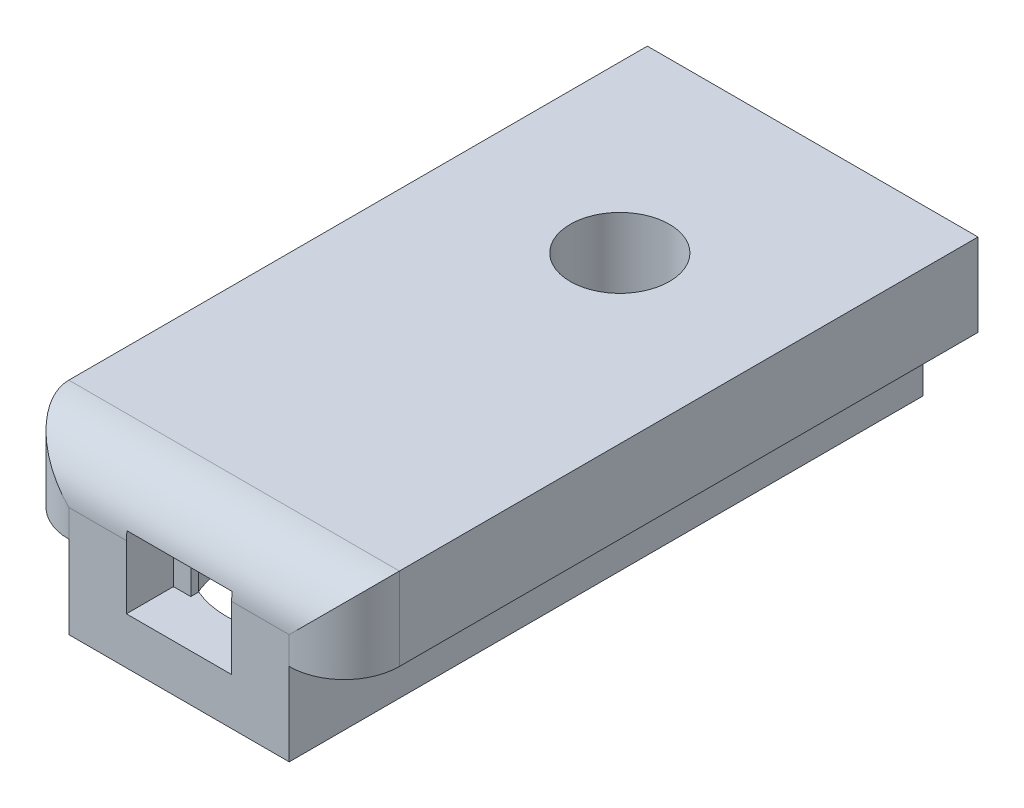
ISO-10303-21;
HEADER;
FILE_DESCRIPTION(('STEP AP214'),'2;1');
FILE_NAME('part.step','',(''),(''),'','','');
FILE_SCHEMA(('AUTOMOTIVE_DESIGN { 1 0 10303 214 1 1 1 1 }'));
ENDSEC;
DATA;
#1=APPLICATION_CONTEXT('core data for automotive mechanical design processes');
#2=APPLICATION_PROTOCOL_DEFINITION('international standard','automotive_design',2000,#1);
#3=PRODUCT_CONTEXT('',#1,'mechanical');
#4=PRODUCT('Part','Part','',(#3));
#5=PRODUCT_RELATED_PRODUCT_CATEGORY('part','',(#4));
#6=PRODUCT_DEFINITION_FORMATION('','',#4);
#7=PRODUCT_DEFINITION_CONTEXT('part definition',#1,'design');
#8=PRODUCT_DEFINITION('design','',#6,#7);
#9=PRODUCT_DEFINITION_SHAPE('','',#8);
#10=(LENGTH_UNIT() NAMED_UNIT(*) SI_UNIT(.MILLI.,.METRE.));
#11=(NAMED_UNIT(*) PLANE_ANGLE_UNIT() SI_UNIT($,.RADIAN.));
#12=(NAMED_UNIT(*) SI_UNIT($,.STERADIAN.) SOLID_ANGLE_UNIT());
#13=UNCERTAINTY_MEASURE_WITH_UNIT(LENGTH_MEASURE(1.E-05),#10,'distance_accuracy_value','');
#14=(GEOMETRIC_REPRESENTATION_CONTEXT(3) GLOBAL_UNCERTAINTY_ASSIGNED_CONTEXT((#13)) GLOBAL_UNIT_ASSIGNED_CONTEXT((#10,
#11,#12)) REPRESENTATION_CONTEXT('',''));
#15=CARTESIAN_POINT('',(0.,0.,0.));
#16=DIRECTION('',(0.,0.,1.));
#17=DIRECTION('',(1.,0.,0.));
#18=AXIS2_PLACEMENT_3D('',#15,#16,#17);
#19=CARTESIAN_POINT('',(0.,0.,9.79));
#20=DIRECTION('',(0.,0.,-1.));
#21=DIRECTION('',(-1.,0.,0.));
#22=AXIS2_PLACEMENT_3D('',#19,#20,#21);
#23=PLANE('',#22);
#24=DIRECTION('',(0.,1.,0.));
#25=VECTOR('',#24,1.);
#26=CARTESIAN_POINT('',(1.28330795126696,3.9,9.79));
#27=LINE('',#26,#25);
#28=CARTESIAN_POINT('',(1.28330795126696,1.7,9.79));
#29=VERTEX_POINT('',#28);
#30=CARTESIAN_POINT('',(1.28330795126696,3.9,9.79));
#31=VERTEX_POINT('',#30);
#32=EDGE_CURVE('E321',#29,#31,#27,.T.);
#33=ORIENTED_EDGE('',*,*,#32,.F.);
#34=DIRECTION('',(1.,0.,0.));
#35=VECTOR('',#34,1.);
#36=CARTESIAN_POINT('',(1.91,1.7,9.79));
#37=LINE('',#36,#35);
#38=CARTESIAN_POINT('',(1.91,1.7,9.79));
#39=VERTEX_POINT('',#38);
#40=EDGE_CURVE('E201',#29,#39,#37,.T.);
#41=ORIENTED_EDGE('',*,*,#40,.T.);
#42=DIRECTION('',(0.,1.,0.));
#43=VECTOR('',#42,1.);
#44=CARTESIAN_POINT('',(1.91,4.3,9.79));
#45=LINE('',#44,#43);
#46=CARTESIAN_POINT('',(1.91,4.3,9.79));
#47=VERTEX_POINT('',#46);
#48=EDGE_CURVE('E206',#39,#47,#45,.T.);
#49=ORIENTED_EDGE('',*,*,#48,.T.);
#50=DIRECTION('',(-1.,0.,0.));
#51=VECTOR('',#50,1.);
#52=CARTESIAN_POINT('',(1.91,4.3,9.79));
#53=LINE('',#52,#51);
#54=CARTESIAN_POINT('',(-1.91,4.3,9.79));
#55=VERTEX_POINT('',#54);
#56=EDGE_CURVE('E209',#47,#55,#53,.T.);
#57=ORIENTED_EDGE('',*,*,#56,.T.);
#58=DIRECTION('',(0.,-1.,0.));
#59=VECTOR('',#58,1.);
#60=CARTESIAN_POINT('',(-1.91,4.3,9.79));
#61=LINE('',#60,#59);
#62=CARTESIAN_POINT('',(-1.91,1.7,9.79));
#63=VERTEX_POINT('',#62);
#64=EDGE_CURVE('E198',#55,#63,#61,.T.);
#65=ORIENTED_EDGE('',*,*,#64,.T.);
#66=CARTESIAN_POINT('',(-1.28330795126696,1.7,9.79));
#67=VERTEX_POINT('',#66);
#68=EDGE_CURVE('E203',#63,#67,#37,.T.);
#69=ORIENTED_EDGE('',*,*,#68,.T.);
#70=DIRECTION('',(0.,-1.,0.));
#71=VECTOR('',#70,1.);
#72=CARTESIAN_POINT('',(-1.28330795126696,3.9,9.79));
#73=LINE('',#72,#71);
#74=CARTESIAN_POINT('',(-1.28330795126696,3.9,9.79));
#75=VERTEX_POINT('',#74);
#76=EDGE_CURVE('E194',#75,#67,#73,.T.);
#77=ORIENTED_EDGE('',*,*,#76,.F.);
#78=DIRECTION('',(-1.,0.,0.));
#79=VECTOR('',#78,1.);
#80=CARTESIAN_POINT('',(-1.28330795126696,3.9,9.79));
#81=LINE('',#80,#79);
#82=EDGE_CURVE('E188',#31,#75,#81,.T.);
#83=ORIENTED_EDGE('',*,*,#82,.F.);
#84=EDGE_LOOP('',(#33,#41,#49,#57,#65,#69,#77,#83));
#85=FACE_BOUND('',#84,.T.);
#86=ADVANCED_FACE('F39',(#85),#23,.F.);
#87=CARTESIAN_POINT('',(-6.,6.,-11.5));
#88=DIRECTION('',(1.,0.,0.));
#89=DIRECTION('',(0.,0.,-1.));
#90=AXIS2_PLACEMENT_3D('',#87,#88,#89);
#91=PLANE('',#90);
#92=DIRECTION('',(0.,0.,1.));
#93=VECTOR('',#92,1.);
#94=CARTESIAN_POINT('',(-6.,3.,-11.5));
#95=LINE('',#94,#93);
#96=CARTESIAN_POINT('',(-6.,3.,-11.5));
#97=VERTEX_POINT('',#96);
#98=CARTESIAN_POINT('',(-6.,3.,9.5));
#99=VERTEX_POINT('',#98);
#100=EDGE_CURVE('E240',#97,#99,#95,.T.);
#101=ORIENTED_EDGE('',*,*,#100,.T.);
#102=DIRECTION('',(0.,-1.,0.));
#103=VECTOR('',#102,1.);
#104=CARTESIAN_POINT('',(-6.,6.,9.5));
#105=LINE('',#104,#103);
#106=CARTESIAN_POINT('',(-6.,6.,9.5));
#107=VERTEX_POINT('',#106);
#108=EDGE_CURVE('E11',#99,#107,#105,.F.);
#109=ORIENTED_EDGE('',*,*,#108,.T.);
#110=DIRECTION('',(0.,0.,1.));
#111=VECTOR('',#110,1.);
#112=CARTESIAN_POINT('',(-6.,6.,-11.5));
#113=LINE('',#112,#111);
#114=CARTESIAN_POINT('',(-6.,6.,-11.5));
#115=VERTEX_POINT('',#114);
#116=EDGE_CURVE('E261',#115,#107,#113,.T.);
#117=ORIENTED_EDGE('',*,*,#116,.F.);
#118=DIRECTION('',(0.,-1.,0.));
#119=VECTOR('',#118,1.);
#120=CARTESIAN_POINT('',(-6.,6.,-11.5));
#121=LINE('',#120,#119);
#122=EDGE_CURVE('E269',#115,#97,#121,.T.);
#123=ORIENTED_EDGE('',*,*,#122,.T.);
#124=EDGE_LOOP('',(#101,#109,#117,#123));
#125=FACE_BOUND('',#124,.T.);
#126=ADVANCED_FACE('F363',(#125),#91,.F.);
#127=CARTESIAN_POINT('',(6.,6.,11.5));
#128=DIRECTION('',(0.,0.,-1.));
#129=DIRECTION('',(-1.,0.,0.));
#130=AXIS2_PLACEMENT_3D('',#127,#128,#129);
#131=PLANE('',#130);
#132=DIRECTION('',(0.,-1.,0.));
#133=VECTOR('',#132,1.);
#134=CARTESIAN_POINT('',(4.,0.,11.5));
#135=LINE('',#134,#133);
#136=CARTESIAN_POINT('',(4.,3.,11.5));
#137=VERTEX_POINT('',#136);
#138=CARTESIAN_POINT('',(4.,0.,11.5));
#139=VERTEX_POINT('',#138);
#140=EDGE_CURVE('E239',#137,#139,#135,.T.);
#141=ORIENTED_EDGE('',*,*,#140,.F.);
#142=DIRECTION('',(0.,-1.,0.));
#143=VECTOR('',#142,1.);
#144=CARTESIAN_POINT('',(4.,6.,11.5));
#145=LINE('',#144,#143);
#146=CARTESIAN_POINT('',(4.,4.,11.5));
#147=VERTEX_POINT('',#146);
#148=EDGE_CURVE('E290',#137,#147,#145,.F.);
#149=ORIENTED_EDGE('',*,*,#148,.T.);
#150=DIRECTION('',(1.,0.,0.));
#151=VECTOR('',#150,1.);
#152=CARTESIAN_POINT('',(6.,4.,11.5));
#153=LINE('',#152,#151);
#154=CARTESIAN_POINT('',(1.91,4.,11.5));
#155=VERTEX_POINT('',#154);
#156=EDGE_CURVE('E288',#147,#155,#153,.F.);
#157=ORIENTED_EDGE('',*,*,#156,.T.);
#158=DIRECTION('',(0.,1.,0.));
#159=VECTOR('',#158,1.);
#160=CARTESIAN_POINT('',(1.91,4.3,11.5));
#161=LINE('',#160,#159);
#162=CARTESIAN_POINT('',(1.91,1.7,11.5));
#163=VERTEX_POINT('',#162);
#164=EDGE_CURVE('E202',#163,#155,#161,.T.);
#165=ORIENTED_EDGE('',*,*,#164,.F.);
#166=DIRECTION('',(1.,0.,0.));
#167=VECTOR('',#166,1.);
#168=CARTESIAN_POINT('',(1.91,1.7,11.5));
#169=LINE('',#168,#167);
#170=CARTESIAN_POINT('',(-1.91,1.7,11.5));
#171=VERTEX_POINT('',#170);
#172=EDGE_CURVE('E215',#171,#163,#169,.T.);
#173=ORIENTED_EDGE('',*,*,#172,.F.);
#174=DIRECTION('',(0.,-1.,0.));
#175=VECTOR('',#174,1.);
#176=CARTESIAN_POINT('',(-1.91,4.3,11.5));
#177=LINE('',#176,#175);
#178=CARTESIAN_POINT('',(-1.91,4.,11.5));
#179=VERTEX_POINT('',#178);
#180=EDGE_CURVE('E213',#179,#171,#177,.T.);
#181=ORIENTED_EDGE('',*,*,#180,.F.);
#182=DIRECTION('',(1.,0.,0.));
#183=VECTOR('',#182,1.);
#184=CARTESIAN_POINT('',(6.,4.,11.5));
#185=LINE('',#184,#183);
#186=CARTESIAN_POINT('',(-4.,4.,11.5));
#187=VERTEX_POINT('',#186);
#188=EDGE_CURVE('E286',#179,#187,#185,.F.);
#189=ORIENTED_EDGE('',*,*,#188,.T.);
#190=DIRECTION('',(0.,-1.,0.));
#191=VECTOR('',#190,1.);
#192=CARTESIAN_POINT('',(-4.,6.,11.5));
#193=LINE('',#192,#191);
#194=CARTESIAN_POINT('',(-4.,3.,11.5));
#195=VERTEX_POINT('',#194);
#196=EDGE_CURVE('E284',#187,#195,#193,.T.);
#197=ORIENTED_EDGE('',*,*,#196,.T.);
#198=DIRECTION('',(0.,1.,0.));
#199=VECTOR('',#198,1.);
#200=CARTESIAN_POINT('',(-4.,0.,11.5));
#201=LINE('',#200,#199);
#202=CARTESIAN_POINT('',(-4.,0.,11.5));
#203=VERTEX_POINT('',#202);
#204=EDGE_CURVE('E233',#203,#195,#201,.T.);
#205=ORIENTED_EDGE('',*,*,#204,.F.);
#206=DIRECTION('',(1.,0.,0.));
#207=VECTOR('',#206,1.);
#208=CARTESIAN_POINT('',(6.,0.,11.5));
#209=LINE('',#208,#207);
#210=EDGE_CURVE('E242',#203,#139,#209,.T.);
#211=ORIENTED_EDGE('',*,*,#210,.T.);
#212=EDGE_LOOP('',(#141,#149,#157,#165,#173,#181,#189,#197,#205,#211));
#213=FACE_BOUND('',#212,.T.);
#214=ADVANCED_FACE('F349',(#213),#131,.F.);
#215=CARTESIAN_POINT('',(6.,6.,-11.5));
#216=DIRECTION('',(-1.,0.,0.));
#217=DIRECTION('',(0.,0.,1.));
#218=AXIS2_PLACEMENT_3D('',#215,#216,#217);
#219=PLANE('',#218);
#220=DIRECTION('',(0.,0.,-1.));
#221=VECTOR('',#220,1.);
#222=CARTESIAN_POINT('',(6.,6.,-11.5));
#223=LINE('',#222,#221);
#224=CARTESIAN_POINT('',(6.,6.,9.5));
#225=VERTEX_POINT('',#224);
#226=CARTESIAN_POINT('',(6.,6.,-11.5));
#227=VERTEX_POINT('',#226);
#228=EDGE_CURVE('E264',#225,#227,#223,.T.);
#229=ORIENTED_EDGE('',*,*,#228,.F.);
#230=DIRECTION('',(0.,-1.,0.));
#231=VECTOR('',#230,1.);
#232=CARTESIAN_POINT('',(6.,6.,9.5));
#233=LINE('',#232,#231);
#234=CARTESIAN_POINT('',(6.,3.,9.5));
#235=VERTEX_POINT('',#234);
#236=EDGE_CURVE('E279',#225,#235,#233,.T.);
#237=ORIENTED_EDGE('',*,*,#236,.T.);
#238=DIRECTION('',(0.,0.,1.));
#239=VECTOR('',#238,1.);
#240=CARTESIAN_POINT('',(6.,3.,-11.5));
#241=LINE('',#240,#239);
#242=CARTESIAN_POINT('',(6.,3.,-11.5));
#243=VERTEX_POINT('',#242);
#244=EDGE_CURVE('E246',#243,#235,#241,.T.);
#245=ORIENTED_EDGE('',*,*,#244,.F.);
#246=DIRECTION('',(0.,-1.,0.));
#247=VECTOR('',#246,1.);
#248=CARTESIAN_POINT('',(6.,6.,-11.5));
#249=LINE('',#248,#247);
#250=EDGE_CURVE('E276',#227,#243,#249,.T.);
#251=ORIENTED_EDGE('',*,*,#250,.F.);
#252=EDGE_LOOP('',(#229,#237,#245,#251));
#253=FACE_BOUND('',#252,.T.);
#254=ADVANCED_FACE('F388',(#253),#219,.F.);
#255=CARTESIAN_POINT('',(6.,6.,-11.5));
#256=DIRECTION('',(0.,0.,1.));
#257=DIRECTION('',(1.,0.,0.));
#258=AXIS2_PLACEMENT_3D('',#255,#256,#257);
#259=PLANE('',#258);
#260=DIRECTION('',(0.,1.,0.));
#261=VECTOR('',#260,1.);
#262=CARTESIAN_POINT('',(-4.,0.,-11.5));
#263=LINE('',#262,#261);
#264=CARTESIAN_POINT('',(-4.,0.,-11.5));
#265=VERTEX_POINT('',#264);
#266=CARTESIAN_POINT('',(-4.,3.,-11.5));
#267=VERTEX_POINT('',#266);
#268=EDGE_CURVE('E229',#265,#267,#263,.T.);
#269=ORIENTED_EDGE('',*,*,#268,.T.);
#270=DIRECTION('',(-1.,0.,0.));
#271=VECTOR('',#270,1.);
#272=CARTESIAN_POINT('',(-6.,3.,-11.5));
#273=LINE('',#272,#271);
#274=EDGE_CURVE('E232',#267,#97,#273,.T.);
#275=ORIENTED_EDGE('',*,*,#274,.T.);
#276=ORIENTED_EDGE('',*,*,#122,.F.);
#277=DIRECTION('',(-1.,0.,0.));
#278=VECTOR('',#277,1.);
#279=CARTESIAN_POINT('',(6.,6.,-11.5));
#280=LINE('',#279,#278);
#281=EDGE_CURVE('E267',#227,#115,#280,.T.);
#282=ORIENTED_EDGE('',*,*,#281,.F.);
#283=ORIENTED_EDGE('',*,*,#250,.T.);
#284=DIRECTION('',(-1.,0.,0.));
#285=VECTOR('',#284,1.);
#286=CARTESIAN_POINT('',(6.,3.,-11.5));
#287=LINE('',#286,#285);
#288=CARTESIAN_POINT('',(4.,3.,-11.5));
#289=VERTEX_POINT('',#288);
#290=EDGE_CURVE('E256',#243,#289,#287,.T.);
#291=ORIENTED_EDGE('',*,*,#290,.T.);
#292=DIRECTION('',(0.,-1.,0.));
#293=VECTOR('',#292,1.);
#294=CARTESIAN_POINT('',(4.,0.,-11.5));
#295=LINE('',#294,#293);
#296=CARTESIAN_POINT('',(4.,0.,-11.5));
#297=VERTEX_POINT('',#296);
#298=EDGE_CURVE('E249',#289,#297,#295,.T.);
#299=ORIENTED_EDGE('',*,*,#298,.T.);
#300=DIRECTION('',(-1.,0.,0.));
#301=VECTOR('',#300,1.);
#302=CARTESIAN_POINT('',(6.,0.,-11.5));
#303=LINE('',#302,#301);
#304=EDGE_CURVE('E265',#297,#265,#303,.T.);
#305=ORIENTED_EDGE('',*,*,#304,.T.);
#306=EDGE_LOOP('',(#269,#275,#276,#282,#283,#291,#299,#305));
#307=FACE_BOUND('',#306,.T.);
#308=ADVANCED_FACE('F371',(#307),#259,.F.);
#309=CARTESIAN_POINT('',(0.,6.,0.));
#310=DIRECTION('',(0.,-1.,0.));
#311=DIRECTION('',(0.,0.,-1.));
#312=AXIS2_PLACEMENT_3D('',#309,#310,#311);
#313=PLANE('',#312);
#314=CARTESIAN_POINT('',(0.,6.,-4.5));
#315=DIRECTION('',(0.,1.,0.));
#316=DIRECTION('',(0.,0.,1.));
#317=AXIS2_PLACEMENT_3D('',#314,#315,#316);
#318=CIRCLE('',#317,1.8);
#319=CARTESIAN_POINT('',(0.,6.,-2.7));
#320=VERTEX_POINT('',#319);
#321=EDGE_CURVE('E566',#320,#320,#318,.T.);
#322=ORIENTED_EDGE('',*,*,#321,.F.);
#323=EDGE_LOOP('',(#322));
#324=FACE_BOUND('',#323,.T.);
#325=ORIENTED_EDGE('',*,*,#116,.T.);
#326=DIRECTION('',(1.,0.,0.));
#327=VECTOR('',#326,1.);
#328=CARTESIAN_POINT('',(0.,6.,9.5));
#329=LINE('',#328,#327);
#330=EDGE_CURVE('E292',#107,#225,#329,.T.);
#331=ORIENTED_EDGE('',*,*,#330,.T.);
#332=ORIENTED_EDGE('',*,*,#228,.T.);
#333=ORIENTED_EDGE('',*,*,#281,.T.);
#334=EDGE_LOOP('',(#325,#331,#332,#333));
#335=FACE_BOUND('',#334,.T.);
#336=ADVANCED_FACE('F365',(#324,#335),#313,.F.);
#337=CARTESIAN_POINT('',(0.,0.,0.));
#338=DIRECTION('',(0.,-1.,0.));
#339=DIRECTION('',(0.,0.,-1.));
#340=AXIS2_PLACEMENT_3D('',#337,#338,#339);
#341=PLANE('',#340);
#342=CARTESIAN_POINT('',(0.,0.,-4.5));
#343=DIRECTION('',(0.,1.,0.));
#344=DIRECTION('',(0.,0.,1.));
#345=AXIS2_PLACEMENT_3D('',#342,#343,#344);
#346=CIRCLE('',#345,0.899999999999999);
#347=CARTESIAN_POINT('',(0.,0.,-3.6));
#348=VERTEX_POINT('',#347);
#349=EDGE_CURVE('E301',#348,#348,#346,.T.);
#350=ORIENTED_EDGE('',*,*,#349,.T.);
#351=EDGE_LOOP('',(#350));
#352=FACE_BOUND('',#351,.T.);
#353=CARTESIAN_POINT('',(0.,0.,6.5));
#354=DIRECTION('',(0.,-1.,0.));
#355=DIRECTION('',(0.,0.,-1.));
#356=AXIS2_PLACEMENT_3D('',#353,#354,#355);
#357=CIRCLE('',#356,3.265);
#358=CARTESIAN_POINT('',(0.,0.,3.235));
#359=VERTEX_POINT('',#358);
#360=EDGE_CURVE('E175',#359,#359,#357,.T.);
#361=ORIENTED_EDGE('',*,*,#360,.F.);
#362=EDGE_LOOP('',(#361));
#363=FACE_BOUND('',#362,.T.);
#364=DIRECTION('',(0.,0.,1.));
#365=VECTOR('',#364,1.);
#366=CARTESIAN_POINT('',(-4.,0.,-11.5));
#367=LINE('',#366,#365);
#368=EDGE_CURVE('E236',#265,#203,#367,.T.);
#369=ORIENTED_EDGE('',*,*,#368,.F.);
#370=ORIENTED_EDGE('',*,*,#304,.F.);
#371=DIRECTION('',(0.,0.,1.));
#372=VECTOR('',#371,1.);
#373=CARTESIAN_POINT('',(4.,0.,-11.5));
#374=LINE('',#373,#372);
#375=EDGE_CURVE('E222',#297,#139,#374,.T.);
#376=ORIENTED_EDGE('',*,*,#375,.T.);
#377=ORIENTED_EDGE('',*,*,#210,.F.);
#378=EDGE_LOOP('',(#369,#370,#376,#377));
#379=FACE_BOUND('',#378,.T.);
#380=ADVANCED_FACE('F379',(#352,#363,#379),#341,.T.);
#381=CARTESIAN_POINT('',(4.,0.,-11.5));
#382=DIRECTION('',(-1.,0.,0.));
#383=DIRECTION('',(0.,0.,1.));
#384=AXIS2_PLACEMENT_3D('',#381,#382,#383);
#385=PLANE('',#384);
#386=ORIENTED_EDGE('',*,*,#140,.T.);
#387=ORIENTED_EDGE('',*,*,#375,.F.);
#388=ORIENTED_EDGE('',*,*,#298,.F.);
#389=DIRECTION('',(0.,0.,1.));
#390=VECTOR('',#389,1.);
#391=CARTESIAN_POINT('',(4.,3.,-11.5));
#392=LINE('',#391,#390);
#393=EDGE_CURVE('E250',#289,#137,#392,.T.);
#394=ORIENTED_EDGE('',*,*,#393,.T.);
#395=EDGE_LOOP('',(#386,#387,#388,#394));
#396=FACE_BOUND('',#395,.T.);
#397=ADVANCED_FACE('F383',(#396),#385,.F.);
#398=CARTESIAN_POINT('',(6.,3.,-11.5));
#399=DIRECTION('',(0.,1.,0.));
#400=DIRECTION('',(0.,0.,1.));
#401=AXIS2_PLACEMENT_3D('',#398,#399,#400);
#402=PLANE('',#401);
#403=ORIENTED_EDGE('',*,*,#244,.T.);
#404=CARTESIAN_POINT('',(4.,3.,9.5));
#405=DIRECTION('',(0.,1.,0.));
#406=DIRECTION('',(0.,0.,1.));
#407=AXIS2_PLACEMENT_3D('',#404,#405,#406);
#408=CIRCLE('',#407,2.);
#409=EDGE_CURVE('E282',#235,#137,#408,.F.);
#410=ORIENTED_EDGE('',*,*,#409,.T.);
#411=ORIENTED_EDGE('',*,*,#393,.F.);
#412=ORIENTED_EDGE('',*,*,#290,.F.);
#413=EDGE_LOOP('',(#403,#410,#411,#412));
#414=FACE_BOUND('',#413,.T.);
#415=ADVANCED_FACE('F386',(#414),#402,.F.);
#416=CARTESIAN_POINT('',(-6.,3.,-11.5));
#417=DIRECTION('',(0.,1.,0.));
#418=DIRECTION('',(0.,0.,1.));
#419=AXIS2_PLACEMENT_3D('',#416,#417,#418);
#420=PLANE('',#419);
#421=DIRECTION('',(0.,0.,1.));
#422=VECTOR('',#421,1.);
#423=CARTESIAN_POINT('',(-4.,3.,-11.5));
#424=LINE('',#423,#422);
#425=EDGE_CURVE('E243',#267,#195,#424,.T.);
#426=ORIENTED_EDGE('',*,*,#425,.T.);
#427=CARTESIAN_POINT('',(-4.,3.,9.5));
#428=DIRECTION('',(0.,1.,0.));
#429=DIRECTION('',(0.,0.,1.));
#430=AXIS2_PLACEMENT_3D('',#427,#428,#429);
#431=CIRCLE('',#430,2.);
#432=EDGE_CURVE('E48',#195,#99,#431,.F.);
#433=ORIENTED_EDGE('',*,*,#432,.T.);
#434=ORIENTED_EDGE('',*,*,#100,.F.);
#435=ORIENTED_EDGE('',*,*,#274,.F.);
#436=EDGE_LOOP('',(#426,#433,#434,#435));
#437=FACE_BOUND('',#436,.T.);
#438=ADVANCED_FACE('F373',(#437),#420,.F.);
#439=CARTESIAN_POINT('',(-4.,0.,-11.5));
#440=DIRECTION('',(1.,0.,0.));
#441=DIRECTION('',(0.,0.,-1.));
#442=AXIS2_PLACEMENT_3D('',#439,#440,#441);
#443=PLANE('',#442);
#444=ORIENTED_EDGE('',*,*,#204,.T.);
#445=ORIENTED_EDGE('',*,*,#425,.F.);
#446=ORIENTED_EDGE('',*,*,#268,.F.);
#447=ORIENTED_EDGE('',*,*,#368,.T.);
#448=EDGE_LOOP('',(#444,#445,#446,#447));
#449=FACE_BOUND('',#448,.T.);
#450=ADVANCED_FACE('F375',(#449),#443,.F.);
#451=CARTESIAN_POINT('',(-1.91,4.3,9.79));
#452=DIRECTION('',(-1.,0.,0.));
#453=DIRECTION('',(0.,-1.,0.));
#454=AXIS2_PLACEMENT_3D('',#451,#452,#453);
#455=PLANE('',#454);
#456=DIRECTION('',(0.,0.,1.));
#457=VECTOR('',#456,1.);
#458=CARTESIAN_POINT('',(-1.91,4.3,9.79));
#459=LINE('',#458,#457);
#460=CARTESIAN_POINT('',(-1.91,4.3,11.4773719933285));
#461=VERTEX_POINT('',#460);
#462=EDGE_CURVE('E220',#55,#461,#459,.T.);
#463=ORIENTED_EDGE('',*,*,#462,.T.);
#464=CARTESIAN_POINT('',(-1.91,4.,9.5));
#465=DIRECTION('',(-1.,0.,0.));
#466=DIRECTION('',(0.,-1.,0.));
#467=AXIS2_PLACEMENT_3D('',#464,#465,#466);
#468=CIRCLE('',#467,2.);
#469=EDGE_CURVE('E297',#461,#179,#468,.F.);
#470=ORIENTED_EDGE('',*,*,#469,.T.);
#471=ORIENTED_EDGE('',*,*,#180,.T.);
#472=DIRECTION('',(0.,0.,1.));
#473=VECTOR('',#472,1.);
#474=CARTESIAN_POINT('',(-1.91,1.7,9.79));
#475=LINE('',#474,#473);
#476=EDGE_CURVE('E212',#63,#171,#475,.T.);
#477=ORIENTED_EDGE('',*,*,#476,.F.);
#478=ORIENTED_EDGE('',*,*,#64,.F.);
#479=EDGE_LOOP('',(#463,#470,#471,#477,#478));
#480=FACE_BOUND('',#479,.T.);
#481=ADVANCED_FACE('F344',(#480),#455,.F.);
#482=CARTESIAN_POINT('',(1.91,4.3,9.79));
#483=DIRECTION('',(0.,1.,0.));
#484=DIRECTION('',(-1.,0.,0.));
#485=AXIS2_PLACEMENT_3D('',#482,#483,#484);
#486=PLANE('',#485);
#487=DIRECTION('',(0.,0.,1.));
#488=VECTOR('',#487,1.);
#489=CARTESIAN_POINT('',(1.91,4.3,9.79));
#490=LINE('',#489,#488);
#491=CARTESIAN_POINT('',(1.91,4.3,11.4773719933285));
#492=VERTEX_POINT('',#491);
#493=EDGE_CURVE('E223',#47,#492,#490,.T.);
#494=ORIENTED_EDGE('',*,*,#493,.T.);
#495=DIRECTION('',(1.,0.,0.));
#496=VECTOR('',#495,1.);
#497=CARTESIAN_POINT('',(1.91,4.3,11.4773719933285));
#498=LINE('',#497,#496);
#499=EDGE_CURVE('E63',#492,#461,#498,.F.);
#500=ORIENTED_EDGE('',*,*,#499,.T.);
#501=ORIENTED_EDGE('',*,*,#462,.F.);
#502=ORIENTED_EDGE('',*,*,#56,.F.);
#503=EDGE_LOOP('',(#494,#500,#501,#502));
#504=FACE_BOUND('',#503,.T.);
#505=ADVANCED_FACE('F340',(#504),#486,.F.);
#506=CARTESIAN_POINT('',(1.91,4.3,9.79));
#507=DIRECTION('',(1.,0.,0.));
#508=DIRECTION('',(0.,1.,0.));
#509=AXIS2_PLACEMENT_3D('',#506,#507,#508);
#510=PLANE('',#509);
#511=ORIENTED_EDGE('',*,*,#164,.T.);
#512=CARTESIAN_POINT('',(1.91,4.,9.5));
#513=DIRECTION('',(1.,0.,0.));
#514=DIRECTION('',(0.,1.,0.));
#515=AXIS2_PLACEMENT_3D('',#512,#513,#514);
#516=CIRCLE('',#515,2.);
#517=EDGE_CURVE('E294',#155,#492,#516,.F.);
#518=ORIENTED_EDGE('',*,*,#517,.T.);
#519=ORIENTED_EDGE('',*,*,#493,.F.);
#520=ORIENTED_EDGE('',*,*,#48,.F.);
#521=DIRECTION('',(0.,0.,1.));
#522=VECTOR('',#521,1.);
#523=CARTESIAN_POINT('',(1.91,1.7,9.79));
#524=LINE('',#523,#522);
#525=EDGE_CURVE('E225',#39,#163,#524,.T.);
#526=ORIENTED_EDGE('',*,*,#525,.T.);
#527=EDGE_LOOP('',(#511,#518,#519,#520,#526));
#528=FACE_BOUND('',#527,.T.);
#529=ADVANCED_FACE('F338',(#528),#510,.F.);
#530=CARTESIAN_POINT('',(1.91,1.7,9.79));
#531=DIRECTION('',(0.,-1.,0.));
#532=DIRECTION('',(1.,0.,0.));
#533=AXIS2_PLACEMENT_3D('',#530,#531,#532);
#534=PLANE('',#533);
#535=DIRECTION('',(0.,0.,1.));
#536=VECTOR('',#535,1.);
#537=CARTESIAN_POINT('',(1.28330795126696,1.7,6.69));
#538=LINE('',#537,#536);
#539=CARTESIAN_POINT('',(1.28330795126696,1.7,9.5022234597403));
#540=VERTEX_POINT('',#539);
#541=EDGE_CURVE('E192',#540,#29,#538,.T.);
#542=ORIENTED_EDGE('',*,*,#541,.F.);
#543=CARTESIAN_POINT('',(0.,1.7,6.5));
#544=DIRECTION('',(0.,-1.,0.));
#545=DIRECTION('',(1.,0.,0.));
#546=AXIS2_PLACEMENT_3D('',#543,#544,#545);
#547=CIRCLE('',#546,3.265);
#548=CARTESIAN_POINT('',(-1.28330795126697,1.7,9.50222345974029));
#549=VERTEX_POINT('',#548);
#550=EDGE_CURVE('E184',#540,#549,#547,.T.);
#551=ORIENTED_EDGE('',*,*,#550,.T.);
#552=DIRECTION('',(0.,0.,1.));
#553=VECTOR('',#552,1.);
#554=CARTESIAN_POINT('',(-1.28330795126696,1.7,6.69));
#555=LINE('',#554,#553);
#556=EDGE_CURVE('E183',#549,#67,#555,.T.);
#557=ORIENTED_EDGE('',*,*,#556,.T.);
#558=ORIENTED_EDGE('',*,*,#68,.F.);
#559=ORIENTED_EDGE('',*,*,#476,.T.);
#560=ORIENTED_EDGE('',*,*,#172,.T.);
#561=ORIENTED_EDGE('',*,*,#525,.F.);
#562=ORIENTED_EDGE('',*,*,#40,.F.);
#563=EDGE_LOOP('',(#542,#551,#557,#558,#559,#560,#561,#562));
#564=FACE_BOUND('',#563,.T.);
#565=ADVANCED_FACE('F333',(#564),#534,.F.);
#566=CARTESIAN_POINT('',(1.28330795126696,3.9,6.69));
#567=DIRECTION('',(1.,0.,0.));
#568=DIRECTION('',(0.,1.,0.));
#569=AXIS2_PLACEMENT_3D('',#566,#567,#568);
#570=PLANE('',#569);
#571=DIRECTION('',(0.,0.,1.));
#572=VECTOR('',#571,1.);
#573=CARTESIAN_POINT('',(1.28330795126696,3.9,6.69));
#574=LINE('',#573,#572);
#575=CARTESIAN_POINT('',(1.28330795126696,3.9,9.5022234597403));
#576=VERTEX_POINT('',#575);
#577=EDGE_CURVE('E190',#576,#31,#574,.T.);
#578=ORIENTED_EDGE('',*,*,#577,.F.);
#579=DIRECTION('',(0.,-1.,0.));
#580=VECTOR('',#579,1.);
#581=CARTESIAN_POINT('',(1.28330795126696,13.1348145622963,9.5022234597403));
#582=LINE('',#581,#580);
#583=EDGE_CURVE('E171',#576,#540,#582,.T.);
#584=ORIENTED_EDGE('',*,*,#583,.T.);
#585=ORIENTED_EDGE('',*,*,#541,.T.);
#586=ORIENTED_EDGE('',*,*,#32,.T.);
#587=EDGE_LOOP('',(#578,#584,#585,#586));
#588=FACE_BOUND('',#587,.T.);
#589=ADVANCED_FACE('F328',(#588),#570,.F.);
#590=CARTESIAN_POINT('',(-1.28330795126696,3.9,6.69));
#591=DIRECTION('',(-1.,0.,0.));
#592=DIRECTION('',(0.,-1.,0.));
#593=AXIS2_PLACEMENT_3D('',#590,#591,#592);
#594=PLANE('',#593);
#595=ORIENTED_EDGE('',*,*,#556,.F.);
#596=DIRECTION('',(0.,-1.,0.));
#597=VECTOR('',#596,1.);
#598=CARTESIAN_POINT('',(-1.28330795126697,13.1348145622963,9.50222345974029));
#599=LINE('',#598,#597);
#600=CARTESIAN_POINT('',(-1.28330795126696,3.9,9.50222345974029));
#601=VERTEX_POINT('',#600);
#602=EDGE_CURVE('E168',#549,#601,#599,.F.);
#603=ORIENTED_EDGE('',*,*,#602,.T.);
#604=DIRECTION('',(0.,0.,1.));
#605=VECTOR('',#604,1.);
#606=CARTESIAN_POINT('',(-1.28330795126696,3.9,6.69));
#607=LINE('',#606,#605);
#608=EDGE_CURVE('E181',#601,#75,#607,.T.);
#609=ORIENTED_EDGE('',*,*,#608,.T.);
#610=ORIENTED_EDGE('',*,*,#76,.T.);
#611=EDGE_LOOP('',(#595,#603,#609,#610));
#612=FACE_BOUND('',#611,.T.);
#613=ADVANCED_FACE('F179',(#612),#594,.F.);
#614=CARTESIAN_POINT('',(-1.28330795126696,3.9,6.69));
#615=DIRECTION('',(0.,1.,0.));
#616=DIRECTION('',(0.,0.,1.));
#617=AXIS2_PLACEMENT_3D('',#614,#615,#616);
#618=PLANE('',#617);
#619=CARTESIAN_POINT('',(0.,3.9,6.5));
#620=DIRECTION('',(0.,1.,0.));
#621=DIRECTION('',(0.,0.,1.));
#622=AXIS2_PLACEMENT_3D('',#619,#620,#621);
#623=CIRCLE('',#622,3.265);
#624=EDGE_CURVE('E165',#601,#576,#623,.F.);
#625=ORIENTED_EDGE('',*,*,#624,.T.);
#626=ORIENTED_EDGE('',*,*,#577,.T.);
#627=ORIENTED_EDGE('',*,*,#82,.T.);
#628=ORIENTED_EDGE('',*,*,#608,.F.);
#629=EDGE_LOOP('',(#625,#626,#627,#628));
#630=FACE_BOUND('',#629,.T.);
#631=ADVANCED_FACE('F186',(#630),#618,.F.);
#632=CARTESIAN_POINT('',(0.,13.1348145622963,6.5));
#633=DIRECTION('',(0.,-1.,0.));
#634=DIRECTION('',(0.,0.,-1.));
#635=AXIS2_PLACEMENT_3D('',#632,#633,#634);
#636=CYLINDRICAL_SURFACE('',#635,3.265);
#637=ORIENTED_EDGE('',*,*,#360,.T.);
#638=EDGE_LOOP('',(#637));
#639=FACE_BOUND('',#638,.T.);
#640=ORIENTED_EDGE('',*,*,#624,.F.);
#641=ORIENTED_EDGE('',*,*,#602,.F.);
#642=ORIENTED_EDGE('',*,*,#550,.F.);
#643=ORIENTED_EDGE('',*,*,#583,.F.);
#644=EDGE_LOOP('',(#640,#641,#642,#643));
#645=FACE_BOUND('',#644,.T.);
#646=ADVANCED_FACE('F167',(#639,#645),#636,.F.);
#647=CARTESIAN_POINT('',(-4.,6.,9.5));
#648=DIRECTION('',(0.,-1.,0.));
#649=DIRECTION('',(0.,0.,-1.));
#650=AXIS2_PLACEMENT_3D('',#647,#648,#649);
#651=CYLINDRICAL_SURFACE('',#650,2.);
#652=ORIENTED_EDGE('',*,*,#432,.F.);
#653=ORIENTED_EDGE('',*,*,#196,.F.);
#654=CARTESIAN_POINT('',(-4.,4.,9.5));
#655=DIRECTION('',(-0.707106781186547,-0.707106781186547,0.));
#656=DIRECTION('',(0.707106781186547,-0.707106781186547,0.));
#657=AXIS2_PLACEMENT_3D('',#654,#655,#656);
#658=ELLIPSE('',#657,2.82842712474619,2.);
#659=EDGE_CURVE('E43',#107,#187,#658,.F.);
#660=ORIENTED_EDGE('',*,*,#659,.F.);
#661=ORIENTED_EDGE('',*,*,#108,.F.);
#662=EDGE_LOOP('',(#652,#653,#660,#661));
#663=FACE_BOUND('',#662,.T.);
#664=ADVANCED_FACE('F41',(#663),#651,.T.);
#665=CARTESIAN_POINT('',(0.,4.,9.5));
#666=DIRECTION('',(1.,0.,0.));
#667=DIRECTION('',(0.,0.,-1.));
#668=AXIS2_PLACEMENT_3D('',#665,#666,#667);
#669=CYLINDRICAL_SURFACE('',#668,2.);
#670=ORIENTED_EDGE('',*,*,#517,.F.);
#671=ORIENTED_EDGE('',*,*,#156,.F.);
#672=CARTESIAN_POINT('',(4.,4.,9.5));
#673=DIRECTION('',(0.707106781186547,-0.707106781186547,0.));
#674=DIRECTION('',(0.707106781186547,0.707106781186547,0.));
#675=AXIS2_PLACEMENT_3D('',#672,#673,#674);
#676=ELLIPSE('',#675,2.82842712474619,2.);
#677=EDGE_CURVE('E299',#225,#147,#676,.T.);
#678=ORIENTED_EDGE('',*,*,#677,.F.);
#679=ORIENTED_EDGE('',*,*,#330,.F.);
#680=ORIENTED_EDGE('',*,*,#659,.T.);
#681=ORIENTED_EDGE('',*,*,#188,.F.);
#682=ORIENTED_EDGE('',*,*,#469,.F.);
#683=ORIENTED_EDGE('',*,*,#499,.F.);
#684=EDGE_LOOP('',(#670,#671,#678,#679,#680,#681,#682,#683));
#685=FACE_BOUND('',#684,.T.);
#686=ADVANCED_FACE('F354',(#685),#669,.T.);
#687=CARTESIAN_POINT('',(4.,6.,9.5));
#688=DIRECTION('',(0.,-1.,0.));
#689=DIRECTION('',(0.,0.,-1.));
#690=AXIS2_PLACEMENT_3D('',#687,#688,#689);
#691=CYLINDRICAL_SURFACE('',#690,2.);
#692=ORIENTED_EDGE('',*,*,#677,.T.);
#693=ORIENTED_EDGE('',*,*,#148,.F.);
#694=ORIENTED_EDGE('',*,*,#409,.F.);
#695=ORIENTED_EDGE('',*,*,#236,.F.);
#696=EDGE_LOOP('',(#692,#693,#694,#695));
#697=FACE_BOUND('',#696,.T.);
#698=ADVANCED_FACE('F389',(#697),#691,.T.);
#699=CARTESIAN_POINT('',(0.,6.,-4.5));
#700=DIRECTION('',(0.,1.,0.));
#701=DIRECTION('',(0.,0.,1.));
#702=AXIS2_PLACEMENT_3D('',#699,#700,#701);
#703=CYLINDRICAL_SURFACE('',#702,0.899999999999999);
#704=ORIENTED_EDGE('',*,*,#349,.F.);
#705=EDGE_LOOP('',(#704));
#706=FACE_BOUND('',#705,.T.);
#707=CARTESIAN_POINT('',(0.,1.1,-4.5));
#708=DIRECTION('',(0.,1.,0.));
#709=DIRECTION('',(0.,0.,1.));
#710=AXIS2_PLACEMENT_3D('',#707,#708,#709);
#711=CIRCLE('',#710,0.899999999999999);
#712=CARTESIAN_POINT('',(0.,1.1,-3.6));
#713=VERTEX_POINT('',#712);
#714=EDGE_CURVE('E308',#713,#713,#711,.T.);
#715=ORIENTED_EDGE('',*,*,#714,.T.);
#716=EDGE_LOOP('',(#715));
#717=FACE_BOUND('',#716,.T.);
#718=ADVANCED_FACE('F391',(#706,#717),#703,.F.);
#719=CARTESIAN_POINT('',(0.,2.,-4.5));
#720=DIRECTION('',(0.,1.,0.));
#721=DIRECTION('',(0.,0.,1.));
#722=AXIS2_PLACEMENT_3D('',#719,#720,#721);
#723=CONICAL_SURFACE('',#722,1.8,0.785398163397448);
#724=ORIENTED_EDGE('',*,*,#714,.F.);
#725=EDGE_LOOP('',(#724));
#726=FACE_BOUND('',#725,.T.);
#727=CARTESIAN_POINT('',(0.,2.,-4.5));
#728=DIRECTION('',(0.,1.,0.));
#729=DIRECTION('',(0.,0.,1.));
#730=AXIS2_PLACEMENT_3D('',#727,#728,#729);
#731=CIRCLE('',#730,1.8);
#732=CARTESIAN_POINT('',(0.,2.,-2.7));
#733=VERTEX_POINT('',#732);
#734=EDGE_CURVE('E313',#733,#733,#731,.T.);
#735=ORIENTED_EDGE('',*,*,#734,.T.);
#736=EDGE_LOOP('',(#735));
#737=FACE_BOUND('',#736,.T.);
#738=ADVANCED_FACE('F397',(#726,#737),#723,.F.);
#739=CARTESIAN_POINT('',(0.,6.,-4.5));
#740=DIRECTION('',(0.,1.,0.));
#741=DIRECTION('',(0.,0.,1.));
#742=AXIS2_PLACEMENT_3D('',#739,#740,#741);
#743=CYLINDRICAL_SURFACE('',#742,1.8);
#744=ORIENTED_EDGE('',*,*,#734,.F.);
#745=EDGE_LOOP('',(#744));
#746=FACE_BOUND('',#745,.T.);
#747=ORIENTED_EDGE('',*,*,#321,.T.);
#748=EDGE_LOOP('',(#747));
#749=FACE_BOUND('',#748,.T.);
#750=ADVANCED_FACE('F544',(#746,#749),#743,.F.);
#751=CLOSED_SHELL('',(#86,#126,#214,#254,#308,#336,#380,#397,#415,#438,#450,#481,#505,#529,#565,
#589,#613,#631,#646,#664,#686,#698,#718,#738,#750));
#752=MANIFOLD_SOLID_BREP('B2',#751);
#753=ADVANCED_BREP_SHAPE_REPRESENTATION('',(#18,#752),#14);
#754=SHAPE_DEFINITION_REPRESENTATION(#9,#753);
ENDSEC;
END-ISO-10303-21;
